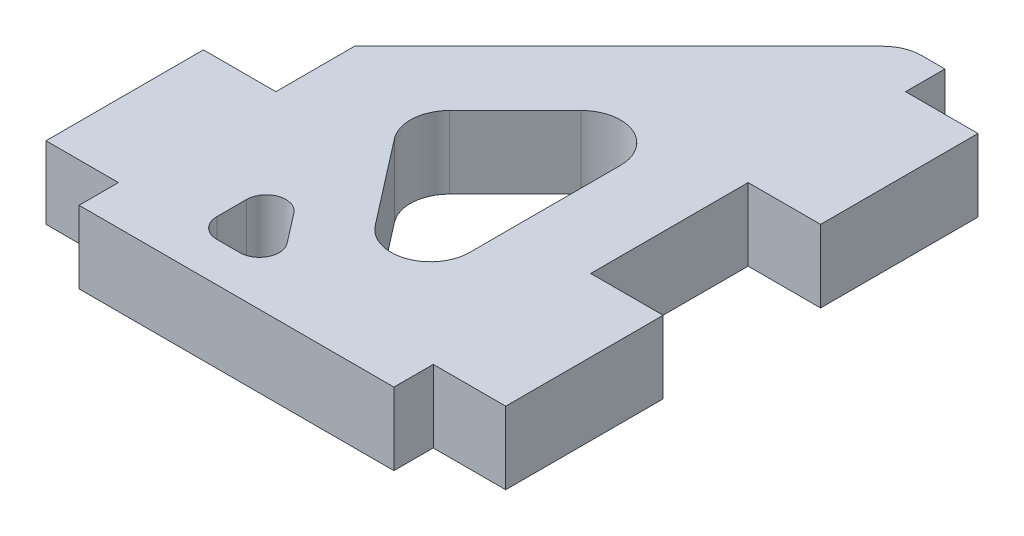
ISO-10303-21;
HEADER;
FILE_DESCRIPTION(('STEP AP214'),'2;1');
FILE_NAME('part.step','',(''),(''),'','','');
FILE_SCHEMA(('AUTOMOTIVE_DESIGN { 1 0 10303 214 1 1 1 1 }'));
ENDSEC;
DATA;
#1=APPLICATION_CONTEXT('core data for automotive mechanical design processes');
#2=APPLICATION_PROTOCOL_DEFINITION('international standard','automotive_design',2000,#1);
#3=PRODUCT_CONTEXT('',#1,'mechanical');
#4=PRODUCT('Part','Part','',(#3));
#5=PRODUCT_RELATED_PRODUCT_CATEGORY('part','',(#4));
#6=PRODUCT_DEFINITION_FORMATION('','',#4);
#7=PRODUCT_DEFINITION_CONTEXT('part definition',#1,'design');
#8=PRODUCT_DEFINITION('design','',#6,#7);
#9=PRODUCT_DEFINITION_SHAPE('','',#8);
#10=(LENGTH_UNIT() NAMED_UNIT(*) SI_UNIT(.MILLI.,.METRE.));
#11=(NAMED_UNIT(*) PLANE_ANGLE_UNIT() SI_UNIT($,.RADIAN.));
#12=(NAMED_UNIT(*) SI_UNIT($,.STERADIAN.) SOLID_ANGLE_UNIT());
#13=UNCERTAINTY_MEASURE_WITH_UNIT(LENGTH_MEASURE(1.E-05),#10,'distance_accuracy_value','');
#14=(GEOMETRIC_REPRESENTATION_CONTEXT(3) GLOBAL_UNCERTAINTY_ASSIGNED_CONTEXT((#13)) GLOBAL_UNIT_ASSIGNED_CONTEXT((#10,
#11,#12)) REPRESENTATION_CONTEXT('',''));
#15=CARTESIAN_POINT('',(0.,0.,0.));
#16=DIRECTION('',(0.,0.,1.));
#17=DIRECTION('',(1.,0.,0.));
#18=AXIS2_PLACEMENT_3D('',#15,#16,#17);
#19=CARTESIAN_POINT('',(12.7,5.842,-31.7499999999998));
#20=DIRECTION('',(0.707106781186545,0.,0.70710678118655));
#21=DIRECTION('',(0.70710678118655,0.,-0.707106781186545));
#22=AXIS2_PLACEMENT_3D('',#19,#20,#21);
#23=PLANE('',#22);
#24=DIRECTION('',(-0.70710678118655,0.,0.707106781186545));
#25=VECTOR('',#24,1.);
#26=CARTESIAN_POINT('',(12.7,5.842,-31.7499999999998));
#27=LINE('',#26,#25);
#28=CARTESIAN_POINT('',(11.7700640302673,5.842,-30.8200640302671));
#29=VERTEX_POINT('',#28);
#30=CARTESIAN_POINT('',(-9.525,5.842,-9.525));
#31=VERTEX_POINT('',#30);
#32=EDGE_CURVE('E278',#29,#31,#27,.T.);
#33=ORIENTED_EDGE('',*,*,#32,.F.);
#34=DIRECTION('',(0.,-1.,0.));
#35=VECTOR('',#34,1.);
#36=CARTESIAN_POINT('',(11.7700640302673,5.842,-30.8200640302671));
#37=LINE('',#36,#35);
#38=CARTESIAN_POINT('',(11.7700640302673,0.,-30.8200640302671));
#39=VERTEX_POINT('',#38);
#40=EDGE_CURVE('E321',#29,#39,#37,.T.);
#41=ORIENTED_EDGE('',*,*,#40,.T.);
#42=DIRECTION('',(-0.70710678118655,0.,0.707106781186545));
#43=VECTOR('',#42,1.);
#44=CARTESIAN_POINT('',(12.7,0.,-31.7499999999998));
#45=LINE('',#44,#43);
#46=CARTESIAN_POINT('',(-9.525,0.,-9.525));
#47=VERTEX_POINT('',#46);
#48=EDGE_CURVE('E402',#39,#47,#45,.T.);
#49=ORIENTED_EDGE('',*,*,#48,.T.);
#50=DIRECTION('',(0.,-1.,0.));
#51=VECTOR('',#50,1.);
#52=CARTESIAN_POINT('',(-9.525,5.842,-9.525));
#53=LINE('',#52,#51);
#54=EDGE_CURVE('E318',#31,#47,#53,.T.);
#55=ORIENTED_EDGE('',*,*,#54,.F.);
#56=EDGE_LOOP('',(#33,#41,#49,#55));
#57=FACE_BOUND('',#56,.T.);
#58=ADVANCED_FACE('F35',(#57),#23,.F.);
#59=CARTESIAN_POINT('',(-9.525,5.842,-3.175));
#60=DIRECTION('',(1.,0.,0.));
#61=DIRECTION('',(0.,0.,-1.));
#62=AXIS2_PLACEMENT_3D('',#59,#60,#61);
#63=PLANE('',#62);
#64=DIRECTION('',(0.,0.,1.));
#65=VECTOR('',#64,1.);
#66=CARTESIAN_POINT('',(-9.525,0.,-3.175));
#67=LINE('',#66,#65);
#68=CARTESIAN_POINT('',(-9.525,0.,-3.175));
#69=VERTEX_POINT('',#68);
#70=EDGE_CURVE('E404',#47,#69,#67,.T.);
#71=ORIENTED_EDGE('',*,*,#70,.T.);
#72=DIRECTION('',(0.,-1.,0.));
#73=VECTOR('',#72,1.);
#74=CARTESIAN_POINT('',(-9.525,5.842,-3.175));
#75=LINE('',#74,#73);
#76=CARTESIAN_POINT('',(-9.525,5.842,-3.175));
#77=VERTEX_POINT('',#76);
#78=EDGE_CURVE('E315',#77,#69,#75,.T.);
#79=ORIENTED_EDGE('',*,*,#78,.F.);
#80=DIRECTION('',(0.,0.,1.));
#81=VECTOR('',#80,1.);
#82=CARTESIAN_POINT('',(-9.525,5.842,-3.175));
#83=LINE('',#82,#81);
#84=EDGE_CURVE('E415',#31,#77,#83,.T.);
#85=ORIENTED_EDGE('',*,*,#84,.F.);
#86=ORIENTED_EDGE('',*,*,#54,.T.);
#87=EDGE_LOOP('',(#71,#79,#85,#86));
#88=FACE_BOUND('',#87,.T.);
#89=ADVANCED_FACE('F472',(#88),#63,.F.);
#90=CARTESIAN_POINT('',(-15.367,5.842,-3.175));
#91=DIRECTION('',(0.,0.,1.));
#92=DIRECTION('',(1.,0.,0.));
#93=AXIS2_PLACEMENT_3D('',#90,#91,#92);
#94=PLANE('',#93);
#95=DIRECTION('',(-1.,0.,0.));
#96=VECTOR('',#95,1.);
#97=CARTESIAN_POINT('',(-15.367,0.,-3.175));
#98=LINE('',#97,#96);
#99=CARTESIAN_POINT('',(-15.367,0.,-3.175));
#100=VERTEX_POINT('',#99);
#101=EDGE_CURVE('E446',#69,#100,#98,.T.);
#102=ORIENTED_EDGE('',*,*,#101,.T.);
#103=DIRECTION('',(0.,-1.,0.));
#104=VECTOR('',#103,1.);
#105=CARTESIAN_POINT('',(-15.367,5.842,-3.175));
#106=LINE('',#105,#104);
#107=CARTESIAN_POINT('',(-15.367,5.842,-3.175));
#108=VERTEX_POINT('',#107);
#109=EDGE_CURVE('E312',#108,#100,#106,.T.);
#110=ORIENTED_EDGE('',*,*,#109,.F.);
#111=DIRECTION('',(-1.,0.,0.));
#112=VECTOR('',#111,1.);
#113=CARTESIAN_POINT('',(-15.367,5.842,-3.175));
#114=LINE('',#113,#112);
#115=EDGE_CURVE('E417',#77,#108,#114,.T.);
#116=ORIENTED_EDGE('',*,*,#115,.F.);
#117=ORIENTED_EDGE('',*,*,#78,.T.);
#118=EDGE_LOOP('',(#102,#110,#116,#117));
#119=FACE_BOUND('',#118,.T.);
#120=ADVANCED_FACE('F468',(#119),#94,.F.);
#121=CARTESIAN_POINT('',(-15.367,5.842,9.525));
#122=DIRECTION('',(1.,0.,0.));
#123=DIRECTION('',(0.,0.,-1.));
#124=AXIS2_PLACEMENT_3D('',#121,#122,#123);
#125=PLANE('',#124);
#126=DIRECTION('',(0.,0.,1.));
#127=VECTOR('',#126,1.);
#128=CARTESIAN_POINT('',(-15.367,0.,9.525));
#129=LINE('',#128,#127);
#130=CARTESIAN_POINT('',(-15.367,0.,9.525));
#131=VERTEX_POINT('',#130);
#132=EDGE_CURVE('E448',#100,#131,#129,.T.);
#133=ORIENTED_EDGE('',*,*,#132,.T.);
#134=DIRECTION('',(0.,-1.,0.));
#135=VECTOR('',#134,1.);
#136=CARTESIAN_POINT('',(-15.367,5.842,9.525));
#137=LINE('',#136,#135);
#138=CARTESIAN_POINT('',(-15.367,5.842,9.525));
#139=VERTEX_POINT('',#138);
#140=EDGE_CURVE('E309',#139,#131,#137,.T.);
#141=ORIENTED_EDGE('',*,*,#140,.F.);
#142=DIRECTION('',(0.,0.,1.));
#143=VECTOR('',#142,1.);
#144=CARTESIAN_POINT('',(-15.367,5.842,9.525));
#145=LINE('',#144,#143);
#146=EDGE_CURVE('E419',#108,#139,#145,.T.);
#147=ORIENTED_EDGE('',*,*,#146,.F.);
#148=ORIENTED_EDGE('',*,*,#109,.T.);
#149=EDGE_LOOP('',(#133,#141,#147,#148));
#150=FACE_BOUND('',#149,.T.);
#151=ADVANCED_FACE('F463',(#150),#125,.F.);
#152=CARTESIAN_POINT('',(-15.367,5.842,9.525));
#153=DIRECTION('',(0.,0.,-1.));
#154=DIRECTION('',(-1.,0.,0.));
#155=AXIS2_PLACEMENT_3D('',#152,#153,#154);
#156=PLANE('',#155);
#157=DIRECTION('',(1.,0.,0.));
#158=VECTOR('',#157,1.);
#159=CARTESIAN_POINT('',(-15.367,0.,9.525));
#160=LINE('',#159,#158);
#161=CARTESIAN_POINT('',(-9.525,0.,9.525));
#162=VERTEX_POINT('',#161);
#163=EDGE_CURVE('E258',#131,#162,#160,.T.);
#164=ORIENTED_EDGE('',*,*,#163,.T.);
#165=DIRECTION('',(0.,-1.,0.));
#166=VECTOR('',#165,1.);
#167=CARTESIAN_POINT('',(-9.525,5.842,9.525));
#168=LINE('',#167,#166);
#169=CARTESIAN_POINT('',(-9.525,5.842,9.525));
#170=VERTEX_POINT('',#169);
#171=EDGE_CURVE('E306',#170,#162,#168,.T.);
#172=ORIENTED_EDGE('',*,*,#171,.F.);
#173=DIRECTION('',(1.,0.,0.));
#174=VECTOR('',#173,1.);
#175=CARTESIAN_POINT('',(-15.367,5.842,9.525));
#176=LINE('',#175,#174);
#177=EDGE_CURVE('E421',#139,#170,#176,.T.);
#178=ORIENTED_EDGE('',*,*,#177,.F.);
#179=ORIENTED_EDGE('',*,*,#140,.T.);
#180=EDGE_LOOP('',(#164,#172,#178,#179));
#181=FACE_BOUND('',#180,.T.);
#182=ADVANCED_FACE('F452',(#181),#156,.F.);
#183=CARTESIAN_POINT('',(-9.525,5.842,15.875));
#184=DIRECTION('',(1.,0.,0.));
#185=DIRECTION('',(0.,0.,-1.));
#186=AXIS2_PLACEMENT_3D('',#183,#184,#185);
#187=PLANE('',#186);
#188=DIRECTION('',(0.,0.,1.));
#189=VECTOR('',#188,1.);
#190=CARTESIAN_POINT('',(-9.525,0.,15.875));
#191=LINE('',#190,#189);
#192=CARTESIAN_POINT('',(-9.525,0.,12.7));
#193=VERTEX_POINT('',#192);
#194=EDGE_CURVE('E254',#162,#193,#191,.T.);
#195=ORIENTED_EDGE('',*,*,#194,.T.);
#196=DIRECTION('',(0.,1.,0.));
#197=VECTOR('',#196,1.);
#198=CARTESIAN_POINT('',(-9.525,0.,12.7));
#199=LINE('',#198,#197);
#200=CARTESIAN_POINT('',(-9.525,5.842,12.7));
#201=VERTEX_POINT('',#200);
#202=EDGE_CURVE('E50',#193,#201,#199,.T.);
#203=ORIENTED_EDGE('',*,*,#202,.T.);
#204=DIRECTION('',(0.,0.,1.));
#205=VECTOR('',#204,1.);
#206=CARTESIAN_POINT('',(-9.525,5.842,15.875));
#207=LINE('',#206,#205);
#208=EDGE_CURVE('E423',#170,#201,#207,.T.);
#209=ORIENTED_EDGE('',*,*,#208,.F.);
#210=ORIENTED_EDGE('',*,*,#171,.T.);
#211=EDGE_LOOP('',(#195,#203,#209,#210));
#212=FACE_BOUND('',#211,.T.);
#213=ADVANCED_FACE('F458',(#212),#187,.F.);
#214=CARTESIAN_POINT('',(15.875,5.842,15.875));
#215=DIRECTION('',(-1.,0.,0.));
#216=DIRECTION('',(0.,0.,1.));
#217=AXIS2_PLACEMENT_3D('',#214,#215,#216);
#218=PLANE('',#217);
#219=DIRECTION('',(0.,0.,-1.));
#220=VECTOR('',#219,1.);
#221=CARTESIAN_POINT('',(15.875,5.842,15.875));
#222=LINE('',#221,#220);
#223=CARTESIAN_POINT('',(15.875,5.842,12.7));
#224=VERTEX_POINT('',#223);
#225=CARTESIAN_POINT('',(15.875,5.842,9.525));
#226=VERTEX_POINT('',#225);
#227=EDGE_CURVE('E247',#224,#226,#222,.T.);
#228=ORIENTED_EDGE('',*,*,#227,.F.);
#229=DIRECTION('',(0.,1.,0.));
#230=VECTOR('',#229,1.);
#231=CARTESIAN_POINT('',(15.875,0.,12.7));
#232=LINE('',#231,#230);
#233=CARTESIAN_POINT('',(15.875,0.,12.7));
#234=VERTEX_POINT('',#233);
#235=EDGE_CURVE('E233',#234,#224,#232,.T.);
#236=ORIENTED_EDGE('',*,*,#235,.F.);
#237=DIRECTION('',(0.,0.,-1.));
#238=VECTOR('',#237,1.);
#239=CARTESIAN_POINT('',(15.875,0.,15.875));
#240=LINE('',#239,#238);
#241=CARTESIAN_POINT('',(15.875,0.,9.525));
#242=VERTEX_POINT('',#241);
#243=EDGE_CURVE('E245',#234,#242,#240,.T.);
#244=ORIENTED_EDGE('',*,*,#243,.T.);
#245=DIRECTION('',(0.,-1.,0.));
#246=VECTOR('',#245,1.);
#247=CARTESIAN_POINT('',(15.875,5.842,9.525));
#248=LINE('',#247,#246);
#249=EDGE_CURVE('E304',#226,#242,#248,.T.);
#250=ORIENTED_EDGE('',*,*,#249,.F.);
#251=EDGE_LOOP('',(#228,#236,#244,#250));
#252=FACE_BOUND('',#251,.T.);
#253=ADVANCED_FACE('F243',(#252),#218,.F.);
#254=CARTESIAN_POINT('',(21.717,5.842,9.525));
#255=DIRECTION('',(0.,0.,-1.));
#256=DIRECTION('',(-1.,0.,0.));
#257=AXIS2_PLACEMENT_3D('',#254,#255,#256);
#258=PLANE('',#257);
#259=DIRECTION('',(1.,0.,0.));
#260=VECTOR('',#259,1.);
#261=CARTESIAN_POINT('',(21.717,0.,9.525));
#262=LINE('',#261,#260);
#263=CARTESIAN_POINT('',(21.717,0.,9.525));
#264=VERTEX_POINT('',#263);
#265=EDGE_CURVE('E253',#242,#264,#262,.T.);
#266=ORIENTED_EDGE('',*,*,#265,.T.);
#267=DIRECTION('',(0.,-1.,0.));
#268=VECTOR('',#267,1.);
#269=CARTESIAN_POINT('',(21.717,5.842,9.525));
#270=LINE('',#269,#268);
#271=CARTESIAN_POINT('',(21.717,5.842,9.525));
#272=VERTEX_POINT('',#271);
#273=EDGE_CURVE('E301',#272,#264,#270,.T.);
#274=ORIENTED_EDGE('',*,*,#273,.F.);
#275=DIRECTION('',(1.,0.,0.));
#276=VECTOR('',#275,1.);
#277=CARTESIAN_POINT('',(21.717,5.842,9.525));
#278=LINE('',#277,#276);
#279=EDGE_CURVE('E427',#226,#272,#278,.T.);
#280=ORIENTED_EDGE('',*,*,#279,.F.);
#281=ORIENTED_EDGE('',*,*,#249,.T.);
#282=EDGE_LOOP('',(#266,#274,#280,#281));
#283=FACE_BOUND('',#282,.T.);
#284=ADVANCED_FACE('F522',(#283),#258,.F.);
#285=CARTESIAN_POINT('',(21.717,5.842,9.525));
#286=DIRECTION('',(-1.,0.,0.));
#287=DIRECTION('',(0.,0.,1.));
#288=AXIS2_PLACEMENT_3D('',#285,#286,#287);
#289=PLANE('',#288);
#290=DIRECTION('',(0.,0.,-1.));
#291=VECTOR('',#290,1.);
#292=CARTESIAN_POINT('',(21.717,0.,9.525));
#293=LINE('',#292,#291);
#294=CARTESIAN_POINT('',(21.717,0.,-3.175));
#295=VERTEX_POINT('',#294);
#296=EDGE_CURVE('E256',#264,#295,#293,.T.);
#297=ORIENTED_EDGE('',*,*,#296,.T.);
#298=DIRECTION('',(0.,-1.,0.));
#299=VECTOR('',#298,1.);
#300=CARTESIAN_POINT('',(21.717,5.842,-3.175));
#301=LINE('',#300,#299);
#302=CARTESIAN_POINT('',(21.717,5.842,-3.175));
#303=VERTEX_POINT('',#302);
#304=EDGE_CURVE('E298',#303,#295,#301,.T.);
#305=ORIENTED_EDGE('',*,*,#304,.F.);
#306=DIRECTION('',(0.,0.,-1.));
#307=VECTOR('',#306,1.);
#308=CARTESIAN_POINT('',(21.717,5.842,9.525));
#309=LINE('',#308,#307);
#310=EDGE_CURVE('E429',#272,#303,#309,.T.);
#311=ORIENTED_EDGE('',*,*,#310,.F.);
#312=ORIENTED_EDGE('',*,*,#273,.T.);
#313=EDGE_LOOP('',(#297,#305,#311,#312));
#314=FACE_BOUND('',#313,.T.);
#315=ADVANCED_FACE('F518',(#314),#289,.F.);
#316=CARTESIAN_POINT('',(21.717,5.842,-3.175));
#317=DIRECTION('',(0.,0.,1.));
#318=DIRECTION('',(1.,0.,0.));
#319=AXIS2_PLACEMENT_3D('',#316,#317,#318);
#320=PLANE('',#319);
#321=DIRECTION('',(-1.,0.,0.));
#322=VECTOR('',#321,1.);
#323=CARTESIAN_POINT('',(21.717,0.,-3.175));
#324=LINE('',#323,#322);
#325=CARTESIAN_POINT('',(15.875,0.,-3.175));
#326=VERTEX_POINT('',#325);
#327=EDGE_CURVE('E263',#295,#326,#324,.T.);
#328=ORIENTED_EDGE('',*,*,#327,.T.);
#329=DIRECTION('',(0.,-1.,0.));
#330=VECTOR('',#329,1.);
#331=CARTESIAN_POINT('',(15.875,5.842,-3.175));
#332=LINE('',#331,#330);
#333=CARTESIAN_POINT('',(15.875,5.842,-3.175));
#334=VERTEX_POINT('',#333);
#335=EDGE_CURVE('E295',#334,#326,#332,.T.);
#336=ORIENTED_EDGE('',*,*,#335,.F.);
#337=DIRECTION('',(-1.,0.,0.));
#338=VECTOR('',#337,1.);
#339=CARTESIAN_POINT('',(21.717,5.842,-3.175));
#340=LINE('',#339,#338);
#341=EDGE_CURVE('E431',#303,#334,#340,.T.);
#342=ORIENTED_EDGE('',*,*,#341,.F.);
#343=ORIENTED_EDGE('',*,*,#304,.T.);
#344=EDGE_LOOP('',(#328,#336,#342,#343));
#345=FACE_BOUND('',#344,.T.);
#346=ADVANCED_FACE('F514',(#345),#320,.F.);
#347=CARTESIAN_POINT('',(15.875,5.842,-3.175));
#348=DIRECTION('',(-1.,0.,0.));
#349=DIRECTION('',(0.,0.,1.));
#350=AXIS2_PLACEMENT_3D('',#347,#348,#349);
#351=PLANE('',#350);
#352=DIRECTION('',(0.,0.,-1.));
#353=VECTOR('',#352,1.);
#354=CARTESIAN_POINT('',(15.875,0.,-3.175));
#355=LINE('',#354,#353);
#356=CARTESIAN_POINT('',(15.875,0.,-15.8749999999998));
#357=VERTEX_POINT('',#356);
#358=EDGE_CURVE('E265',#326,#357,#355,.T.);
#359=ORIENTED_EDGE('',*,*,#358,.T.);
#360=DIRECTION('',(0.,-1.,0.));
#361=VECTOR('',#360,1.);
#362=CARTESIAN_POINT('',(15.875,5.842,-15.8749999999998));
#363=LINE('',#362,#361);
#364=CARTESIAN_POINT('',(15.875,5.842,-15.8749999999998));
#365=VERTEX_POINT('',#364);
#366=EDGE_CURVE('E292',#365,#357,#363,.T.);
#367=ORIENTED_EDGE('',*,*,#366,.F.);
#368=DIRECTION('',(0.,0.,-1.));
#369=VECTOR('',#368,1.);
#370=CARTESIAN_POINT('',(15.875,5.842,-3.175));
#371=LINE('',#370,#369);
#372=EDGE_CURVE('E433',#334,#365,#371,.T.);
#373=ORIENTED_EDGE('',*,*,#372,.F.);
#374=ORIENTED_EDGE('',*,*,#335,.T.);
#375=EDGE_LOOP('',(#359,#367,#373,#374));
#376=FACE_BOUND('',#375,.T.);
#377=ADVANCED_FACE('F509',(#376),#351,.F.);
#378=CARTESIAN_POINT('',(21.717,5.842,-15.8749999999998));
#379=DIRECTION('',(0.,0.,-1.));
#380=DIRECTION('',(-1.,0.,0.));
#381=AXIS2_PLACEMENT_3D('',#378,#379,#380);
#382=PLANE('',#381);
#383=DIRECTION('',(1.,0.,0.));
#384=VECTOR('',#383,1.);
#385=CARTESIAN_POINT('',(21.717,0.,-15.8749999999998));
#386=LINE('',#385,#384);
#387=CARTESIAN_POINT('',(21.717,0.,-15.8749999999998));
#388=VERTEX_POINT('',#387);
#389=EDGE_CURVE('E267',#357,#388,#386,.T.);
#390=ORIENTED_EDGE('',*,*,#389,.T.);
#391=DIRECTION('',(0.,-1.,0.));
#392=VECTOR('',#391,1.);
#393=CARTESIAN_POINT('',(21.717,5.842,-15.8749999999998));
#394=LINE('',#393,#392);
#395=CARTESIAN_POINT('',(21.717,5.842,-15.8749999999998));
#396=VERTEX_POINT('',#395);
#397=EDGE_CURVE('E289',#396,#388,#394,.T.);
#398=ORIENTED_EDGE('',*,*,#397,.F.);
#399=DIRECTION('',(1.,0.,0.));
#400=VECTOR('',#399,1.);
#401=CARTESIAN_POINT('',(21.717,5.842,-15.8749999999998));
#402=LINE('',#401,#400);
#403=EDGE_CURVE('E435',#365,#396,#402,.T.);
#404=ORIENTED_EDGE('',*,*,#403,.F.);
#405=ORIENTED_EDGE('',*,*,#366,.T.);
#406=EDGE_LOOP('',(#390,#398,#404,#405));
#407=FACE_BOUND('',#406,.T.);
#408=ADVANCED_FACE('F504',(#407),#382,.F.);
#409=CARTESIAN_POINT('',(21.717,5.842,-15.8749999999998));
#410=DIRECTION('',(-1.,0.,0.));
#411=DIRECTION('',(0.,0.,1.));
#412=AXIS2_PLACEMENT_3D('',#409,#410,#411);
#413=PLANE('',#412);
#414=DIRECTION('',(0.,0.,-1.));
#415=VECTOR('',#414,1.);
#416=CARTESIAN_POINT('',(21.717,0.,-15.8749999999998));
#417=LINE('',#416,#415);
#418=CARTESIAN_POINT('',(21.717,0.,-28.5749999999998));
#419=VERTEX_POINT('',#418);
#420=EDGE_CURVE('E269',#388,#419,#417,.T.);
#421=ORIENTED_EDGE('',*,*,#420,.T.);
#422=DIRECTION('',(0.,-1.,0.));
#423=VECTOR('',#422,1.);
#424=CARTESIAN_POINT('',(21.717,5.842,-28.5749999999998));
#425=LINE('',#424,#423);
#426=CARTESIAN_POINT('',(21.717,5.842,-28.5749999999998));
#427=VERTEX_POINT('',#426);
#428=EDGE_CURVE('E286',#427,#419,#425,.T.);
#429=ORIENTED_EDGE('',*,*,#428,.F.);
#430=DIRECTION('',(0.,0.,-1.));
#431=VECTOR('',#430,1.);
#432=CARTESIAN_POINT('',(21.717,5.842,-15.8749999999998));
#433=LINE('',#432,#431);
#434=EDGE_CURVE('E437',#396,#427,#433,.T.);
#435=ORIENTED_EDGE('',*,*,#434,.F.);
#436=ORIENTED_EDGE('',*,*,#397,.T.);
#437=EDGE_LOOP('',(#421,#429,#435,#436));
#438=FACE_BOUND('',#437,.T.);
#439=ADVANCED_FACE('F500',(#438),#413,.F.);
#440=CARTESIAN_POINT('',(21.717,5.842,-28.5749999999998));
#441=DIRECTION('',(0.,0.,1.));
#442=DIRECTION('',(1.,0.,0.));
#443=AXIS2_PLACEMENT_3D('',#440,#441,#442);
#444=PLANE('',#443);
#445=DIRECTION('',(-1.,0.,0.));
#446=VECTOR('',#445,1.);
#447=CARTESIAN_POINT('',(21.717,0.,-28.5749999999998));
#448=LINE('',#447,#446);
#449=CARTESIAN_POINT('',(15.875,0.,-28.5749999999998));
#450=VERTEX_POINT('',#449);
#451=EDGE_CURVE('E271',#419,#450,#448,.T.);
#452=ORIENTED_EDGE('',*,*,#451,.T.);
#453=DIRECTION('',(0.,-1.,0.));
#454=VECTOR('',#453,1.);
#455=CARTESIAN_POINT('',(15.875,5.842,-28.5749999999998));
#456=LINE('',#455,#454);
#457=CARTESIAN_POINT('',(15.875,5.842,-28.5749999999998));
#458=VERTEX_POINT('',#457);
#459=EDGE_CURVE('E282',#458,#450,#456,.T.);
#460=ORIENTED_EDGE('',*,*,#459,.F.);
#461=DIRECTION('',(-1.,0.,0.));
#462=VECTOR('',#461,1.);
#463=CARTESIAN_POINT('',(21.717,5.842,-28.5749999999998));
#464=LINE('',#463,#462);
#465=EDGE_CURVE('E439',#427,#458,#464,.T.);
#466=ORIENTED_EDGE('',*,*,#465,.F.);
#467=ORIENTED_EDGE('',*,*,#428,.T.);
#468=EDGE_LOOP('',(#452,#460,#466,#467));
#469=FACE_BOUND('',#468,.T.);
#470=ADVANCED_FACE('F496',(#469),#444,.F.);
#471=CARTESIAN_POINT('',(15.875,5.842,-28.5749999999998));
#472=DIRECTION('',(-1.,0.,0.));
#473=DIRECTION('',(0.,0.,1.));
#474=AXIS2_PLACEMENT_3D('',#471,#472,#473);
#475=PLANE('',#474);
#476=DIRECTION('',(0.,0.,-1.));
#477=VECTOR('',#476,1.);
#478=CARTESIAN_POINT('',(15.875,0.,-28.5749999999998));
#479=LINE('',#478,#477);
#480=CARTESIAN_POINT('',(15.875,0.,-31.7499999999998));
#481=VERTEX_POINT('',#480);
#482=EDGE_CURVE('E273',#450,#481,#479,.T.);
#483=ORIENTED_EDGE('',*,*,#482,.T.);
#484=DIRECTION('',(0.,-1.,0.));
#485=VECTOR('',#484,1.);
#486=CARTESIAN_POINT('',(15.875,5.842,-31.7499999999998));
#487=LINE('',#486,#485);
#488=CARTESIAN_POINT('',(15.875,5.842,-31.7499999999998));
#489=VERTEX_POINT('',#488);
#490=EDGE_CURVE('E279',#489,#481,#487,.T.);
#491=ORIENTED_EDGE('',*,*,#490,.F.);
#492=DIRECTION('',(0.,0.,-1.));
#493=VECTOR('',#492,1.);
#494=CARTESIAN_POINT('',(15.875,5.842,-28.5749999999998));
#495=LINE('',#494,#493);
#496=EDGE_CURVE('E441',#458,#489,#495,.T.);
#497=ORIENTED_EDGE('',*,*,#496,.F.);
#498=ORIENTED_EDGE('',*,*,#459,.T.);
#499=EDGE_LOOP('',(#483,#491,#497,#498));
#500=FACE_BOUND('',#499,.T.);
#501=ADVANCED_FACE('F491',(#500),#475,.F.);
#502=CARTESIAN_POINT('',(15.875,5.842,-31.7499999999998));
#503=DIRECTION('',(0.,0.,1.));
#504=DIRECTION('',(1.,0.,0.));
#505=AXIS2_PLACEMENT_3D('',#502,#503,#504);
#506=PLANE('',#505);
#507=DIRECTION('',(-1.,0.,0.));
#508=VECTOR('',#507,1.);
#509=CARTESIAN_POINT('',(15.875,0.,-31.7499999999998));
#510=LINE('',#509,#508);
#511=CARTESIAN_POINT('',(14.0151280605346,0.,-31.7499999999998));
#512=VERTEX_POINT('',#511);
#513=EDGE_CURVE('E275',#481,#512,#510,.T.);
#514=ORIENTED_EDGE('',*,*,#513,.T.);
#515=DIRECTION('',(0.,-1.,0.));
#516=VECTOR('',#515,1.);
#517=CARTESIAN_POINT('',(14.0151280605346,5.842,-31.7499999999998));
#518=LINE('',#517,#516);
#519=CARTESIAN_POINT('',(14.0151280605346,5.842,-31.7499999999998));
#520=VERTEX_POINT('',#519);
#521=EDGE_CURVE('E326',#512,#520,#518,.F.);
#522=ORIENTED_EDGE('',*,*,#521,.T.);
#523=DIRECTION('',(-1.,0.,0.));
#524=VECTOR('',#523,1.);
#525=CARTESIAN_POINT('',(15.875,5.842,-31.7499999999998));
#526=LINE('',#525,#524);
#527=EDGE_CURVE('E283',#489,#520,#526,.T.);
#528=ORIENTED_EDGE('',*,*,#527,.F.);
#529=ORIENTED_EDGE('',*,*,#490,.T.);
#530=EDGE_LOOP('',(#514,#522,#528,#529));
#531=FACE_BOUND('',#530,.T.);
#532=ADVANCED_FACE('F482',(#531),#506,.F.);
#533=CARTESIAN_POINT('',(0.,5.842,0.));
#534=DIRECTION('',(0.,-1.,0.));
#535=DIRECTION('',(0.,0.,-1.));
#536=AXIS2_PLACEMENT_3D('',#533,#534,#535);
#537=PLANE('',#536);
#538=DIRECTION('',(1.,0.,0.));
#539=VECTOR('',#538,1.);
#540=CARTESIAN_POINT('',(-3.175,5.842,9.525));
#541=LINE('',#540,#539);
#542=CARTESIAN_POINT('',(-1.5875,5.842,9.525));
#543=VERTEX_POINT('',#542);
#544=CARTESIAN_POINT('',(0.269370010188705,5.842,9.525));
#545=VERTEX_POINT('',#544);
#546=EDGE_CURVE('E574',#543,#545,#541,.T.);
#547=ORIENTED_EDGE('',*,*,#546,.F.);
#548=CARTESIAN_POINT('',(-1.5875,5.842,7.9375));
#549=DIRECTION('',(0.,-1.,0.));
#550=DIRECTION('',(0.,0.,-1.));
#551=AXIS2_PLACEMENT_3D('',#548,#549,#550);
#552=CIRCLE('',#551,1.5875);
#553=CARTESIAN_POINT('',(-3.175,5.842,7.9375));
#554=VERTEX_POINT('',#553);
#555=EDGE_CURVE('E349',#543,#554,#552,.T.);
#556=ORIENTED_EDGE('',*,*,#555,.T.);
#557=DIRECTION('',(0.,0.,1.));
#558=VECTOR('',#557,1.);
#559=CARTESIAN_POINT('',(-3.175,5.842,0.889537058324326));
#560=LINE('',#559,#558);
#561=CARTESIAN_POINT('',(-3.175,5.842,5.53676535560899));
#562=VERTEX_POINT('',#561);
#563=EDGE_CURVE('E577',#562,#554,#560,.T.);
#564=ORIENTED_EDGE('',*,*,#563,.F.);
#565=CARTESIAN_POINT('',(-1.5875,5.842,5.53676535560899));
#566=DIRECTION('',(0.,-1.,0.));
#567=DIRECTION('',(0.,0.,-1.));
#568=AXIS2_PLACEMENT_3D('',#565,#566,#567);
#569=CIRCLE('',#568,1.5875);
#570=CARTESIAN_POINT('',(-0.331779804812273,5.842,4.56551716827596));
#571=VERTEX_POINT('',#570);
#572=EDGE_CURVE('E345',#562,#571,#569,.T.);
#573=ORIENTED_EDGE('',*,*,#572,.T.);
#574=DIRECTION('',(-0.611809881784589,0.,-0.791004847362346));
#575=VECTOR('',#574,1.);
#576=CARTESIAN_POINT('',(-3.175,5.842,0.889537058324326));
#577=LINE('',#576,#575);
#578=CARTESIAN_POINT('',(1.52509020537643,5.842,6.96625181266697));
#579=VERTEX_POINT('',#578);
#580=EDGE_CURVE('E570',#579,#571,#577,.T.);
#581=ORIENTED_EDGE('',*,*,#580,.F.);
#582=CARTESIAN_POINT('',(0.269370010188705,5.842,7.9375));
#583=DIRECTION('',(0.,-1.,0.));
#584=DIRECTION('',(0.,0.,-1.));
#585=AXIS2_PLACEMENT_3D('',#582,#583,#584);
#586=CIRCLE('',#585,1.5875);
#587=EDGE_CURVE('E353',#579,#545,#586,.T.);
#588=ORIENTED_EDGE('',*,*,#587,.T.);
#589=EDGE_LOOP('',(#547,#556,#564,#573,#581,#588));
#590=FACE_BOUND('',#589,.T.);
#591=DIRECTION('',(0.,0.,-1.));
#592=VECTOR('',#591,1.);
#593=CARTESIAN_POINT('',(9.525,5.842,-19.5947438789307));
#594=LINE('',#593,#592);
#595=CARTESIAN_POINT('',(9.525,5.842,0.230543405430671));
#596=VERTEX_POINT('',#595);
#597=CARTESIAN_POINT('',(9.525,5.842,-11.9296158183961));
#598=VERTEX_POINT('',#597);
#599=EDGE_CURVE('E383',#596,#598,#594,.T.);
#600=ORIENTED_EDGE('',*,*,#599,.F.);
#601=CARTESIAN_POINT('',(6.35,5.842,0.230543405430678));
#602=DIRECTION('',(0.,-1.,0.));
#603=DIRECTION('',(0.,0.,-1.));
#604=AXIS2_PLACEMENT_3D('',#601,#602,#603);
#605=CIRCLE('',#604,3.175);
#606=CARTESIAN_POINT('',(3.83855960962455,5.842,2.17303978009675));
#607=VERTEX_POINT('',#606);
#608=EDGE_CURVE('E375',#596,#607,#605,.T.);
#609=ORIENTED_EDGE('',*,*,#608,.T.);
#610=DIRECTION('',(0.611809881784589,0.,0.791004847362346));
#611=VECTOR('',#610,1.);
#612=CARTESIAN_POINT('',(-3.175,5.842,-6.89474387893066));
#613=LINE('',#612,#611);
#614=CARTESIAN_POINT('',(-1.46485318084093,5.842,-4.68370665326453));
#615=VERTEX_POINT('',#614);
#616=EDGE_CURVE('E390',#615,#607,#613,.T.);
#617=ORIENTED_EDGE('',*,*,#616,.F.);
#618=CARTESIAN_POINT('',(1.04658720953452,5.842,-6.6262030279306));
#619=DIRECTION('',(0.,-1.,0.));
#620=DIRECTION('',(0.,0.,-1.));
#621=AXIS2_PLACEMENT_3D('',#618,#619,#620);
#622=CIRCLE('',#621,3.175);
#623=CARTESIAN_POINT('',(-1.19847682073277,5.842,-8.87126705819789));
#624=VERTEX_POINT('',#623);
#625=EDGE_CURVE('E371',#615,#624,#622,.T.);
#626=ORIENTED_EDGE('',*,*,#625,.T.);
#627=DIRECTION('',(-0.707106781186547,0.,0.707106781186548));
#628=VECTOR('',#627,1.);
#629=CARTESIAN_POINT('',(-3.175,5.842,-6.89474387893066));
#630=LINE('',#629,#628);
#631=CARTESIAN_POINT('',(4.10493596973271,5.842,-14.1746798486634));
#632=VERTEX_POINT('',#631);
#633=EDGE_CURVE('E385',#632,#624,#630,.T.);
#634=ORIENTED_EDGE('',*,*,#633,.F.);
#635=CARTESIAN_POINT('',(6.35,5.842,-11.9296158183961));
#636=DIRECTION('',(0.,-1.,0.));
#637=DIRECTION('',(0.,0.,-1.));
#638=AXIS2_PLACEMENT_3D('',#635,#636,#637);
#639=CIRCLE('',#638,3.175);
#640=EDGE_CURVE('E43',#632,#598,#639,.T.);
#641=ORIENTED_EDGE('',*,*,#640,.T.);
#642=EDGE_LOOP('',(#600,#609,#617,#626,#634,#641));
#643=FACE_BOUND('',#642,.T.);
#644=ORIENTED_EDGE('',*,*,#208,.T.);
#645=DIRECTION('',(-1.,0.,0.));
#646=VECTOR('',#645,1.);
#647=CARTESIAN_POINT('',(-9.525,5.842,12.7));
#648=LINE('',#647,#646);
#649=EDGE_CURVE('E239',#224,#201,#648,.T.);
#650=ORIENTED_EDGE('',*,*,#649,.F.);
#651=ORIENTED_EDGE('',*,*,#227,.T.);
#652=ORIENTED_EDGE('',*,*,#279,.T.);
#653=ORIENTED_EDGE('',*,*,#310,.T.);
#654=ORIENTED_EDGE('',*,*,#341,.T.);
#655=ORIENTED_EDGE('',*,*,#372,.T.);
#656=ORIENTED_EDGE('',*,*,#403,.T.);
#657=ORIENTED_EDGE('',*,*,#434,.T.);
#658=ORIENTED_EDGE('',*,*,#465,.T.);
#659=ORIENTED_EDGE('',*,*,#496,.T.);
#660=ORIENTED_EDGE('',*,*,#527,.T.);
#661=CARTESIAN_POINT('',(14.0151280605346,5.842,-28.5749999999998));
#662=DIRECTION('',(0.,-1.,0.));
#663=DIRECTION('',(0.,0.,-1.));
#664=AXIS2_PLACEMENT_3D('',#661,#662,#663);
#665=CIRCLE('',#664,3.175);
#666=EDGE_CURVE('E328',#520,#29,#665,.F.);
#667=ORIENTED_EDGE('',*,*,#666,.T.);
#668=ORIENTED_EDGE('',*,*,#32,.T.);
#669=ORIENTED_EDGE('',*,*,#84,.T.);
#670=ORIENTED_EDGE('',*,*,#115,.T.);
#671=ORIENTED_EDGE('',*,*,#146,.T.);
#672=ORIENTED_EDGE('',*,*,#177,.T.);
#673=EDGE_LOOP('',(#644,#650,#651,#652,#653,#654,#655,#656,#657,#658,#659,#660,#667,#668,#669,
#670,#671,#672));
#674=FACE_BOUND('',#673,.T.);
#675=ADVANCED_FACE('F381',(#590,#643,#674),#537,.F.);
#676=CARTESIAN_POINT('',(0.,0.,0.));
#677=DIRECTION('',(0.,-1.,0.));
#678=DIRECTION('',(0.,0.,-1.));
#679=AXIS2_PLACEMENT_3D('',#676,#677,#678);
#680=PLANE('',#679);
#681=DIRECTION('',(-1.,0.,0.));
#682=VECTOR('',#681,1.);
#683=CARTESIAN_POINT('',(-9.525,0.,12.7));
#684=LINE('',#683,#682);
#685=EDGE_CURVE('E230',#234,#193,#684,.T.);
#686=ORIENTED_EDGE('',*,*,#685,.T.);
#687=ORIENTED_EDGE('',*,*,#194,.F.);
#688=ORIENTED_EDGE('',*,*,#163,.F.);
#689=ORIENTED_EDGE('',*,*,#132,.F.);
#690=ORIENTED_EDGE('',*,*,#101,.F.);
#691=ORIENTED_EDGE('',*,*,#70,.F.);
#692=ORIENTED_EDGE('',*,*,#48,.F.);
#693=CARTESIAN_POINT('',(14.0151280605346,0.,-28.5749999999998));
#694=DIRECTION('',(0.,-1.,0.));
#695=DIRECTION('',(0.,0.,-1.));
#696=AXIS2_PLACEMENT_3D('',#693,#694,#695);
#697=CIRCLE('',#696,3.175);
#698=EDGE_CURVE('E324',#39,#512,#697,.T.);
#699=ORIENTED_EDGE('',*,*,#698,.T.);
#700=ORIENTED_EDGE('',*,*,#513,.F.);
#701=ORIENTED_EDGE('',*,*,#482,.F.);
#702=ORIENTED_EDGE('',*,*,#451,.F.);
#703=ORIENTED_EDGE('',*,*,#420,.F.);
#704=ORIENTED_EDGE('',*,*,#389,.F.);
#705=ORIENTED_EDGE('',*,*,#358,.F.);
#706=ORIENTED_EDGE('',*,*,#327,.F.);
#707=ORIENTED_EDGE('',*,*,#296,.F.);
#708=ORIENTED_EDGE('',*,*,#265,.F.);
#709=ORIENTED_EDGE('',*,*,#243,.F.);
#710=EDGE_LOOP('',(#686,#687,#688,#689,#690,#691,#692,#699,#700,#701,#702,#703,#704,#705,#706,
#707,#708,#709));
#711=FACE_BOUND('',#710,.T.);
#712=DIRECTION('',(-0.611809881784589,0.,-0.791004847362346));
#713=VECTOR('',#712,1.);
#714=CARTESIAN_POINT('',(-3.175,0.,0.889537058324326));
#715=LINE('',#714,#713);
#716=CARTESIAN_POINT('',(1.52509020537643,0.,6.96625181266697));
#717=VERTEX_POINT('',#716);
#718=CARTESIAN_POINT('',(-0.331779804812273,0.,4.56551716827596));
#719=VERTEX_POINT('',#718);
#720=EDGE_CURVE('E411',#717,#719,#715,.T.);
#721=ORIENTED_EDGE('',*,*,#720,.T.);
#722=CARTESIAN_POINT('',(-1.5875,0.,5.53676535560899));
#723=DIRECTION('',(0.,-1.,0.));
#724=DIRECTION('',(0.,0.,-1.));
#725=AXIS2_PLACEMENT_3D('',#722,#723,#724);
#726=CIRCLE('',#725,1.5875);
#727=CARTESIAN_POINT('',(-3.175,0.,5.53676535560899));
#728=VERTEX_POINT('',#727);
#729=EDGE_CURVE('E347',#719,#728,#726,.F.);
#730=ORIENTED_EDGE('',*,*,#729,.T.);
#731=DIRECTION('',(0.,0.,1.));
#732=VECTOR('',#731,1.);
#733=CARTESIAN_POINT('',(-3.175,0.,0.889537058324326));
#734=LINE('',#733,#732);
#735=CARTESIAN_POINT('',(-3.175,0.,7.9375));
#736=VERTEX_POINT('',#735);
#737=EDGE_CURVE('E573',#728,#736,#734,.T.);
#738=ORIENTED_EDGE('',*,*,#737,.T.);
#739=CARTESIAN_POINT('',(-1.5875,0.,7.9375));
#740=DIRECTION('',(0.,-1.,0.));
#741=DIRECTION('',(0.,0.,-1.));
#742=AXIS2_PLACEMENT_3D('',#739,#740,#741);
#743=CIRCLE('',#742,1.5875);
#744=CARTESIAN_POINT('',(-1.5875,0.,9.525));
#745=VERTEX_POINT('',#744);
#746=EDGE_CURVE('E351',#736,#745,#743,.F.);
#747=ORIENTED_EDGE('',*,*,#746,.T.);
#748=DIRECTION('',(1.,0.,0.));
#749=VECTOR('',#748,1.);
#750=CARTESIAN_POINT('',(-3.175,0.,9.525));
#751=LINE('',#750,#749);
#752=CARTESIAN_POINT('',(0.269370010188705,0.,9.525));
#753=VERTEX_POINT('',#752);
#754=EDGE_CURVE('E582',#745,#753,#751,.T.);
#755=ORIENTED_EDGE('',*,*,#754,.T.);
#756=CARTESIAN_POINT('',(0.269370010188705,0.,7.9375));
#757=DIRECTION('',(0.,-1.,0.));
#758=DIRECTION('',(0.,0.,-1.));
#759=AXIS2_PLACEMENT_3D('',#756,#757,#758);
#760=CIRCLE('',#759,1.5875);
#761=EDGE_CURVE('E355',#753,#717,#760,.F.);
#762=ORIENTED_EDGE('',*,*,#761,.T.);
#763=EDGE_LOOP('',(#721,#730,#738,#747,#755,#762));
#764=FACE_BOUND('',#763,.T.);
#765=DIRECTION('',(-0.707106781186547,0.,0.707106781186548));
#766=VECTOR('',#765,1.);
#767=CARTESIAN_POINT('',(-3.175,0.,-6.89474387893066));
#768=LINE('',#767,#766);
#769=CARTESIAN_POINT('',(4.10493596973271,0.,-14.1746798486634));
#770=VERTEX_POINT('',#769);
#771=CARTESIAN_POINT('',(-1.19847682073277,0.,-8.87126705819789));
#772=VERTEX_POINT('',#771);
#773=EDGE_CURVE('E396',#770,#772,#768,.T.);
#774=ORIENTED_EDGE('',*,*,#773,.T.);
#775=CARTESIAN_POINT('',(1.04658720953452,0.,-6.6262030279306));
#776=DIRECTION('',(0.,-1.,0.));
#777=DIRECTION('',(0.,0.,-1.));
#778=AXIS2_PLACEMENT_3D('',#775,#776,#777);
#779=CIRCLE('',#778,3.175);
#780=CARTESIAN_POINT('',(-1.46485318084093,0.,-4.68370665326453));
#781=VERTEX_POINT('',#780);
#782=EDGE_CURVE('E373',#772,#781,#779,.F.);
#783=ORIENTED_EDGE('',*,*,#782,.T.);
#784=DIRECTION('',(0.611809881784589,0.,0.791004847362346));
#785=VECTOR('',#784,1.);
#786=CARTESIAN_POINT('',(-3.175,0.,-6.89474387893066));
#787=LINE('',#786,#785);
#788=CARTESIAN_POINT('',(3.83855960962455,0.,2.17303978009675));
#789=VERTEX_POINT('',#788);
#790=EDGE_CURVE('E406',#781,#789,#787,.T.);
#791=ORIENTED_EDGE('',*,*,#790,.T.);
#792=CARTESIAN_POINT('',(6.35,0.,0.230543405430678));
#793=DIRECTION('',(0.,-1.,0.));
#794=DIRECTION('',(0.,0.,-1.));
#795=AXIS2_PLACEMENT_3D('',#792,#793,#794);
#796=CIRCLE('',#795,3.175);
#797=CARTESIAN_POINT('',(9.525,0.,0.230543405430671));
#798=VERTEX_POINT('',#797);
#799=EDGE_CURVE('E377',#789,#798,#796,.F.);
#800=ORIENTED_EDGE('',*,*,#799,.T.);
#801=DIRECTION('',(0.,0.,-1.));
#802=VECTOR('',#801,1.);
#803=CARTESIAN_POINT('',(9.525,0.,-19.5947438789307));
#804=LINE('',#803,#802);
#805=CARTESIAN_POINT('',(9.525,0.,-11.9296158183961));
#806=VERTEX_POINT('',#805);
#807=EDGE_CURVE('E398',#798,#806,#804,.T.);
#808=ORIENTED_EDGE('',*,*,#807,.T.);
#809=CARTESIAN_POINT('',(6.35,0.,-11.9296158183961));
#810=DIRECTION('',(0.,-1.,0.));
#811=DIRECTION('',(0.,0.,-1.));
#812=AXIS2_PLACEMENT_3D('',#809,#810,#811);
#813=CIRCLE('',#812,3.175);
#814=EDGE_CURVE('E11',#806,#770,#813,.F.);
#815=ORIENTED_EDGE('',*,*,#814,.T.);
#816=EDGE_LOOP('',(#774,#783,#791,#800,#808,#815));
#817=FACE_BOUND('',#816,.T.);
#818=ADVANCED_FACE('F250',(#711,#764,#817),#680,.T.);
#819=CARTESIAN_POINT('',(-3.175,0.,-6.89474387893066));
#820=DIRECTION('',(-0.791004847362346,0.,0.611809881784589));
#821=DIRECTION('',(0.611809881784589,0.,0.791004847362346));
#822=AXIS2_PLACEMENT_3D('',#819,#820,#821);
#823=PLANE('',#822);
#824=ORIENTED_EDGE('',*,*,#790,.F.);
#825=DIRECTION('',(0.,1.,0.));
#826=VECTOR('',#825,1.);
#827=CARTESIAN_POINT('',(-1.46485318084093,5.842,-4.68370665326453));
#828=LINE('',#827,#826);
#829=EDGE_CURVE('E359',#781,#615,#828,.T.);
#830=ORIENTED_EDGE('',*,*,#829,.T.);
#831=ORIENTED_EDGE('',*,*,#616,.T.);
#832=DIRECTION('',(0.,1.,0.));
#833=VECTOR('',#832,1.);
#834=CARTESIAN_POINT('',(3.83855960962456,0.,2.17303978009675));
#835=LINE('',#834,#833);
#836=EDGE_CURVE('E357',#607,#789,#835,.F.);
#837=ORIENTED_EDGE('',*,*,#836,.T.);
#838=EDGE_LOOP('',(#824,#830,#831,#837));
#839=FACE_BOUND('',#838,.T.);
#840=ADVANCED_FACE('F620',(#839),#823,.F.);
#841=CARTESIAN_POINT('',(-3.175,0.,-6.89474387893066));
#842=DIRECTION('',(-0.707106781186548,0.,-0.707106781186547));
#843=DIRECTION('',(-0.707106781186547,0.,0.707106781186548));
#844=AXIS2_PLACEMENT_3D('',#841,#842,#843);
#845=PLANE('',#844);
#846=ORIENTED_EDGE('',*,*,#633,.T.);
#847=DIRECTION('',(0.,1.,0.));
#848=VECTOR('',#847,1.);
#849=CARTESIAN_POINT('',(-1.19847682073277,0.,-8.87126705819789));
#850=LINE('',#849,#848);
#851=EDGE_CURVE('E365',#624,#772,#850,.F.);
#852=ORIENTED_EDGE('',*,*,#851,.T.);
#853=ORIENTED_EDGE('',*,*,#773,.F.);
#854=DIRECTION('',(0.,1.,0.));
#855=VECTOR('',#854,1.);
#856=CARTESIAN_POINT('',(4.10493596973271,5.842,-14.1746798486634));
#857=LINE('',#856,#855);
#858=EDGE_CURVE('E362',#770,#632,#857,.T.);
#859=ORIENTED_EDGE('',*,*,#858,.T.);
#860=EDGE_LOOP('',(#846,#852,#853,#859));
#861=FACE_BOUND('',#860,.T.);
#862=ADVANCED_FACE('F400',(#861),#845,.F.);
#863=CARTESIAN_POINT('',(9.525,0.,-19.5947438789307));
#864=DIRECTION('',(1.,0.,0.));
#865=DIRECTION('',(0.,0.,-1.));
#866=AXIS2_PLACEMENT_3D('',#863,#864,#865);
#867=PLANE('',#866);
#868=ORIENTED_EDGE('',*,*,#807,.F.);
#869=DIRECTION('',(0.,1.,0.));
#870=VECTOR('',#869,1.);
#871=CARTESIAN_POINT('',(9.525,5.842,0.230543405430678));
#872=LINE('',#871,#870);
#873=EDGE_CURVE('E368',#798,#596,#872,.T.);
#874=ORIENTED_EDGE('',*,*,#873,.T.);
#875=ORIENTED_EDGE('',*,*,#599,.T.);
#876=DIRECTION('',(0.,1.,0.));
#877=VECTOR('',#876,1.);
#878=CARTESIAN_POINT('',(9.525,0.,-11.9296158183961));
#879=LINE('',#878,#877);
#880=EDGE_CURVE('E58',#598,#806,#879,.F.);
#881=ORIENTED_EDGE('',*,*,#880,.T.);
#882=EDGE_LOOP('',(#868,#874,#875,#881));
#883=FACE_BOUND('',#882,.T.);
#884=ADVANCED_FACE('F388',(#883),#867,.F.);
#885=CARTESIAN_POINT('',(-3.175,0.,0.889537058324326));
#886=DIRECTION('',(-1.,0.,0.));
#887=DIRECTION('',(0.,0.,1.));
#888=AXIS2_PLACEMENT_3D('',#885,#886,#887);
#889=PLANE('',#888);
#890=ORIENTED_EDGE('',*,*,#737,.F.);
#891=DIRECTION('',(0.,1.,0.));
#892=VECTOR('',#891,1.);
#893=CARTESIAN_POINT('',(-3.175,5.842,5.53676535560899));
#894=LINE('',#893,#892);
#895=EDGE_CURVE('E332',#728,#562,#894,.T.);
#896=ORIENTED_EDGE('',*,*,#895,.T.);
#897=ORIENTED_EDGE('',*,*,#563,.T.);
#898=DIRECTION('',(0.,1.,0.));
#899=VECTOR('',#898,1.);
#900=CARTESIAN_POINT('',(-3.175,0.,7.9375));
#901=LINE('',#900,#899);
#902=EDGE_CURVE('E330',#554,#736,#901,.F.);
#903=ORIENTED_EDGE('',*,*,#902,.T.);
#904=EDGE_LOOP('',(#890,#896,#897,#903));
#905=FACE_BOUND('',#904,.T.);
#906=ADVANCED_FACE('F608',(#905),#889,.F.);
#907=CARTESIAN_POINT('',(-3.175,0.,0.889537058324326));
#908=DIRECTION('',(0.791004847362346,0.,-0.611809881784589));
#909=DIRECTION('',(-0.611809881784589,0.,-0.791004847362346));
#910=AXIS2_PLACEMENT_3D('',#907,#908,#909);
#911=PLANE('',#910);
#912=ORIENTED_EDGE('',*,*,#580,.T.);
#913=DIRECTION('',(0.,1.,0.));
#914=VECTOR('',#913,1.);
#915=CARTESIAN_POINT('',(-0.331779804812274,0.,4.56551716827595));
#916=LINE('',#915,#914);
#917=EDGE_CURVE('E338',#571,#719,#916,.F.);
#918=ORIENTED_EDGE('',*,*,#917,.T.);
#919=ORIENTED_EDGE('',*,*,#720,.F.);
#920=DIRECTION('',(0.,1.,0.));
#921=VECTOR('',#920,1.);
#922=CARTESIAN_POINT('',(1.52509020537643,5.842,6.96625181266697));
#923=LINE('',#922,#921);
#924=EDGE_CURVE('E335',#717,#579,#923,.T.);
#925=ORIENTED_EDGE('',*,*,#924,.T.);
#926=EDGE_LOOP('',(#912,#918,#919,#925));
#927=FACE_BOUND('',#926,.T.);
#928=ADVANCED_FACE('F606',(#927),#911,.F.);
#929=CARTESIAN_POINT('',(-3.175,0.,9.525));
#930=DIRECTION('',(0.,0.,1.));
#931=DIRECTION('',(1.,0.,0.));
#932=AXIS2_PLACEMENT_3D('',#929,#930,#931);
#933=PLANE('',#932);
#934=ORIENTED_EDGE('',*,*,#754,.F.);
#935=DIRECTION('',(0.,1.,0.));
#936=VECTOR('',#935,1.);
#937=CARTESIAN_POINT('',(-1.5875,5.842,9.525));
#938=LINE('',#937,#936);
#939=EDGE_CURVE('E342',#745,#543,#938,.T.);
#940=ORIENTED_EDGE('',*,*,#939,.T.);
#941=ORIENTED_EDGE('',*,*,#546,.T.);
#942=DIRECTION('',(0.,1.,0.));
#943=VECTOR('',#942,1.);
#944=CARTESIAN_POINT('',(0.269370010188705,0.,9.525));
#945=LINE('',#944,#943);
#946=EDGE_CURVE('E340',#545,#753,#945,.F.);
#947=ORIENTED_EDGE('',*,*,#946,.T.);
#948=EDGE_LOOP('',(#934,#940,#941,#947));
#949=FACE_BOUND('',#948,.T.);
#950=ADVANCED_FACE('F542',(#949),#933,.F.);
#951=CARTESIAN_POINT('',(14.0151280605346,5.842,-28.5749999999998));
#952=DIRECTION('',(0.,-1.,0.));
#953=DIRECTION('',(0.,0.,-1.));
#954=AXIS2_PLACEMENT_3D('',#951,#952,#953);
#955=CYLINDRICAL_SURFACE('',#954,3.175);
#956=ORIENTED_EDGE('',*,*,#666,.F.);
#957=ORIENTED_EDGE('',*,*,#521,.F.);
#958=ORIENTED_EDGE('',*,*,#698,.F.);
#959=ORIENTED_EDGE('',*,*,#40,.F.);
#960=EDGE_LOOP('',(#956,#957,#958,#959));
#961=FACE_BOUND('',#960,.T.);
#962=ADVANCED_FACE('F486',(#961),#955,.T.);
#963=CARTESIAN_POINT('',(-1.5875,0.,5.53676535560899));
#964=DIRECTION('',(0.,-1.,0.));
#965=DIRECTION('',(0.,0.,-1.));
#966=AXIS2_PLACEMENT_3D('',#963,#964,#965);
#967=CYLINDRICAL_SURFACE('',#966,1.5875);
#968=ORIENTED_EDGE('',*,*,#729,.F.);
#969=ORIENTED_EDGE('',*,*,#917,.F.);
#970=ORIENTED_EDGE('',*,*,#572,.F.);
#971=ORIENTED_EDGE('',*,*,#895,.F.);
#972=EDGE_LOOP('',(#968,#969,#970,#971));
#973=FACE_BOUND('',#972,.T.);
#974=ADVANCED_FACE('F541',(#973),#967,.F.);
#975=CARTESIAN_POINT('',(-1.5875,0.,7.9375));
#976=DIRECTION('',(0.,-1.,0.));
#977=DIRECTION('',(0.,0.,-1.));
#978=AXIS2_PLACEMENT_3D('',#975,#976,#977);
#979=CYLINDRICAL_SURFACE('',#978,1.5875);
#980=ORIENTED_EDGE('',*,*,#746,.F.);
#981=ORIENTED_EDGE('',*,*,#902,.F.);
#982=ORIENTED_EDGE('',*,*,#555,.F.);
#983=ORIENTED_EDGE('',*,*,#939,.F.);
#984=EDGE_LOOP('',(#980,#981,#982,#983));
#985=FACE_BOUND('',#984,.T.);
#986=ADVANCED_FACE('F545',(#985),#979,.F.);
#987=CARTESIAN_POINT('',(0.269370010188705,0.,7.9375));
#988=DIRECTION('',(0.,-1.,0.));
#989=DIRECTION('',(0.,0.,-1.));
#990=AXIS2_PLACEMENT_3D('',#987,#988,#989);
#991=CYLINDRICAL_SURFACE('',#990,1.5875);
#992=ORIENTED_EDGE('',*,*,#761,.F.);
#993=ORIENTED_EDGE('',*,*,#946,.F.);
#994=ORIENTED_EDGE('',*,*,#587,.F.);
#995=ORIENTED_EDGE('',*,*,#924,.F.);
#996=EDGE_LOOP('',(#992,#993,#994,#995));
#997=FACE_BOUND('',#996,.T.);
#998=ADVANCED_FACE('F549',(#997),#991,.F.);
#999=CARTESIAN_POINT('',(1.04658720953452,0.,-6.6262030279306));
#1000=DIRECTION('',(0.,-1.,0.));
#1001=DIRECTION('',(0.,0.,-1.));
#1002=AXIS2_PLACEMENT_3D('',#999,#1000,#1001);
#1003=CYLINDRICAL_SURFACE('',#1002,3.175);
#1004=ORIENTED_EDGE('',*,*,#782,.F.);
#1005=ORIENTED_EDGE('',*,*,#851,.F.);
#1006=ORIENTED_EDGE('',*,*,#625,.F.);
#1007=ORIENTED_EDGE('',*,*,#829,.F.);
#1008=EDGE_LOOP('',(#1004,#1005,#1006,#1007));
#1009=FACE_BOUND('',#1008,.T.);
#1010=ADVANCED_FACE('F553',(#1009),#1003,.F.);
#1011=CARTESIAN_POINT('',(6.35,0.,0.230543405430678));
#1012=DIRECTION('',(0.,-1.,0.));
#1013=DIRECTION('',(0.,0.,-1.));
#1014=AXIS2_PLACEMENT_3D('',#1011,#1012,#1013);
#1015=CYLINDRICAL_SURFACE('',#1014,3.175);
#1016=ORIENTED_EDGE('',*,*,#799,.F.);
#1017=ORIENTED_EDGE('',*,*,#836,.F.);
#1018=ORIENTED_EDGE('',*,*,#608,.F.);
#1019=ORIENTED_EDGE('',*,*,#873,.F.);
#1020=EDGE_LOOP('',(#1016,#1017,#1018,#1019));
#1021=FACE_BOUND('',#1020,.T.);
#1022=ADVANCED_FACE('F556',(#1021),#1015,.F.);
#1023=CARTESIAN_POINT('',(6.35,0.,-11.9296158183961));
#1024=DIRECTION('',(0.,-1.,0.));
#1025=DIRECTION('',(0.,0.,-1.));
#1026=AXIS2_PLACEMENT_3D('',#1023,#1024,#1025);
#1027=CYLINDRICAL_SURFACE('',#1026,3.175);
#1028=ORIENTED_EDGE('',*,*,#814,.F.);
#1029=ORIENTED_EDGE('',*,*,#880,.F.);
#1030=ORIENTED_EDGE('',*,*,#640,.F.);
#1031=ORIENTED_EDGE('',*,*,#858,.F.);
#1032=EDGE_LOOP('',(#1028,#1029,#1030,#1031));
#1033=FACE_BOUND('',#1032,.T.);
#1034=ADVANCED_FACE('F37',(#1033),#1027,.F.);
#1035=CARTESIAN_POINT('',(-9.525,0.,12.7));
#1036=DIRECTION('',(0.,0.,-1.));
#1037=DIRECTION('',(-1.,0.,0.));
#1038=AXIS2_PLACEMENT_3D('',#1035,#1036,#1037);
#1039=PLANE('',#1038);
#1040=ORIENTED_EDGE('',*,*,#649,.T.);
#1041=ORIENTED_EDGE('',*,*,#202,.F.);
#1042=ORIENTED_EDGE('',*,*,#685,.F.);
#1043=ORIENTED_EDGE('',*,*,#235,.T.);
#1044=EDGE_LOOP('',(#1040,#1041,#1042,#1043));
#1045=FACE_BOUND('',#1044,.T.);
#1046=ADVANCED_FACE('F232',(#1045),#1039,.F.);
#1047=CLOSED_SHELL('',(#58,#89,#120,#151,#182,#213,#253,#284,#315,#346,#377,#408,#439,#470,#501,
#532,#675,#818,#840,#862,#884,#906,#928,#950,#962,#974,#986,#998,#1010,#1022,#1034,#1046));
#1048=MANIFOLD_SOLID_BREP('B2',#1047);
#1049=ADVANCED_BREP_SHAPE_REPRESENTATION('',(#18,#1048),#14);
#1050=SHAPE_DEFINITION_REPRESENTATION(#9,#1049);
ENDSEC;
END-ISO-10303-21;
